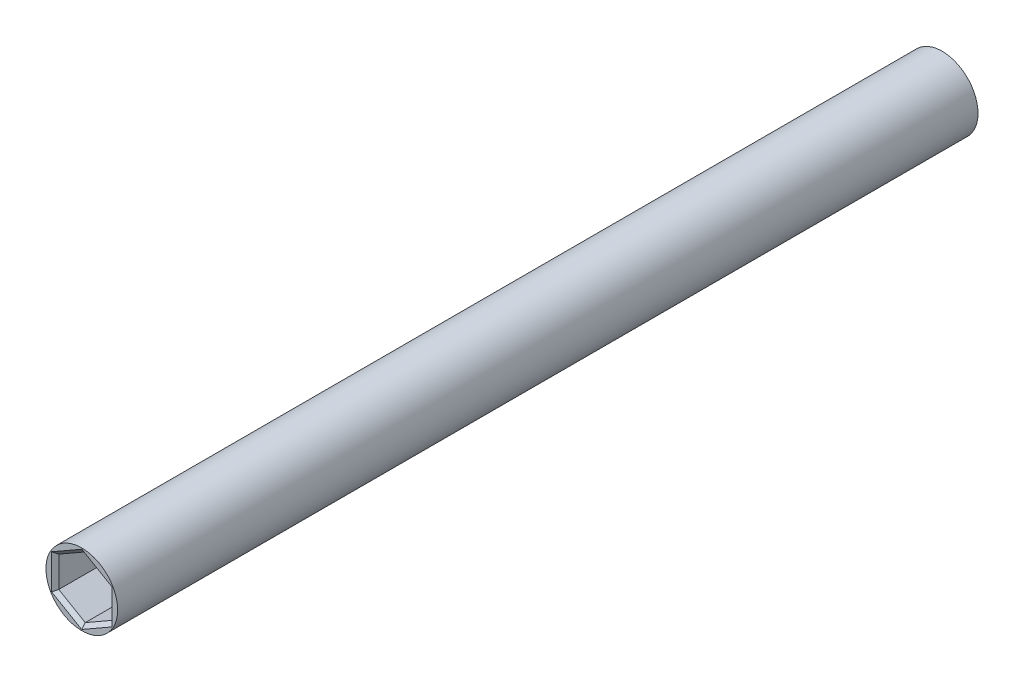
ISO-10303-21;
HEADER;
FILE_DESCRIPTION(('STEP AP214'),'2;1');
FILE_NAME('part.step','',(''),(''),'','','');
FILE_SCHEMA(('AUTOMOTIVE_DESIGN { 1 0 10303 214 1 1 1 1 }'));
ENDSEC;
DATA;
#1=APPLICATION_CONTEXT('core data for automotive mechanical design processes');
#2=APPLICATION_PROTOCOL_DEFINITION('international standard','automotive_design',2000,#1);
#3=PRODUCT_CONTEXT('',#1,'mechanical');
#4=PRODUCT('Part','Part','',(#3));
#5=PRODUCT_RELATED_PRODUCT_CATEGORY('part','',(#4));
#6=PRODUCT_DEFINITION_FORMATION('','',#4);
#7=PRODUCT_DEFINITION_CONTEXT('part definition',#1,'design');
#8=PRODUCT_DEFINITION('design','',#6,#7);
#9=PRODUCT_DEFINITION_SHAPE('','',#8);
#10=(LENGTH_UNIT() NAMED_UNIT(*) SI_UNIT(.MILLI.,.METRE.));
#11=(NAMED_UNIT(*) PLANE_ANGLE_UNIT() SI_UNIT($,.RADIAN.));
#12=(NAMED_UNIT(*) SI_UNIT($,.STERADIAN.) SOLID_ANGLE_UNIT());
#13=UNCERTAINTY_MEASURE_WITH_UNIT(LENGTH_MEASURE(1.E-05),#10,'distance_accuracy_value','');
#14=(GEOMETRIC_REPRESENTATION_CONTEXT(3) GLOBAL_UNCERTAINTY_ASSIGNED_CONTEXT((#13)) GLOBAL_UNIT_ASSIGNED_CONTEXT((#10,
#11,#12)) REPRESENTATION_CONTEXT('',''));
#15=CARTESIAN_POINT('',(0.,0.,0.));
#16=DIRECTION('',(0.,0.,1.));
#17=DIRECTION('',(1.,0.,0.));
#18=AXIS2_PLACEMENT_3D('',#15,#16,#17);
#19=CARTESIAN_POINT('',(0.,0.,23.9552079046517));
#20=DIRECTION('',(0.,0.,-1.));
#21=DIRECTION('',(-1.,0.,0.));
#22=AXIS2_PLACEMENT_3D('',#19,#20,#21);
#23=CYLINDRICAL_SURFACE('',#22,1.449675);
#24=CARTESIAN_POINT('',(0.,0.,23.9552079046517));
#25=DIRECTION('',(0.,0.,1.));
#26=DIRECTION('',(1.,0.,0.));
#27=AXIS2_PLACEMENT_3D('',#24,#25,#26);
#28=CIRCLE('',#27,1.449675);
#29=CARTESIAN_POINT('',(1.449675,0.,23.9552079046517));
#30=VERTEX_POINT('',#29);
#31=EDGE_CURVE('E157',#30,#30,#28,.T.);
#32=ORIENTED_EDGE('',*,*,#31,.F.);
#33=EDGE_LOOP('',(#32));
#34=FACE_BOUND('',#33,.T.);
#35=CARTESIAN_POINT('',(0.,0.,-10.8369920953483));
#36=DIRECTION('',(0.,0.,1.));
#37=DIRECTION('',(1.,0.,0.));
#38=AXIS2_PLACEMENT_3D('',#35,#36,#37);
#39=CIRCLE('',#38,1.449675);
#40=CARTESIAN_POINT('',(1.449675,0.,-10.8369920953483));
#41=VERTEX_POINT('',#40);
#42=EDGE_CURVE('E148',#41,#41,#39,.T.);
#43=ORIENTED_EDGE('',*,*,#42,.T.);
#44=EDGE_LOOP('',(#43));
#45=FACE_BOUND('',#44,.T.);
#46=ADVANCED_FACE('F38',(#34,#45),#23,.T.);
#47=CARTESIAN_POINT('',(0.,0.,23.9552079046517));
#48=DIRECTION('',(0.,0.,1.));
#49=DIRECTION('',(1.,0.,0.));
#50=AXIS2_PLACEMENT_3D('',#47,#48,#49);
#51=PLANE('',#50);
#52=DIRECTION('',(0.864101821053046,-0.503317040097799,0.));
#53=VECTOR('',#52,1.);
#54=CARTESIAN_POINT('',(1.14915011875448,0.741112704872409,23.9552079046517));
#55=LINE('',#54,#53);
#56=CARTESIAN_POINT('',(0.00539631231939755,1.40731981892981,23.9552079046517));
#57=VERTEX_POINT('',#56);
#58=CARTESIAN_POINT('',(1.22147287060223,0.698986565909552,23.9552079046517));
#59=VERTEX_POINT('',#58);
#60=EDGE_CURVE('E172',#57,#59,#55,.T.);
#61=ORIENTED_EDGE('',*,*,#60,.T.);
#62=DIRECTION('',(-0.00383443235576127,-0.999992648537233,0.));
#63=VECTOR('',#62,1.);
#64=CARTESIAN_POINT('',(1.21639748886415,-0.624636843167081,23.9552079046517));
#65=LINE('',#64,#63);
#66=CARTESIAN_POINT('',(1.21607655828283,-0.708333253020259,23.9552079046517));
#67=VERTEX_POINT('',#66);
#68=EDGE_CURVE('E174',#59,#67,#65,.T.);
#69=ORIENTED_EDGE('',*,*,#68,.T.);
#70=DIRECTION('',(-0.867936253408808,-0.496675608439434,0.));
#71=VECTOR('',#70,1.);
#72=CARTESIAN_POINT('',(0.0672473701096651,-1.36574954803949,23.9552079046517));
#73=LINE('',#72,#71);
#74=CARTESIAN_POINT('',(-0.00539631231939688,-1.40731981892981,23.9552079046517));
#75=VERTEX_POINT('',#74);
#76=EDGE_CURVE('E164',#67,#75,#73,.T.);
#77=ORIENTED_EDGE('',*,*,#76,.T.);
#78=DIRECTION('',(-0.864101821053046,0.503317040097799,0.));
#79=VECTOR('',#78,1.);
#80=CARTESIAN_POINT('',(-1.14915011875448,-0.741112704872408,23.9552079046517));
#81=LINE('',#80,#79);
#82=CARTESIAN_POINT('',(-1.22147287060223,-0.698986565909552,23.9552079046517));
#83=VERTEX_POINT('',#82);
#84=EDGE_CURVE('E166',#75,#83,#81,.T.);
#85=ORIENTED_EDGE('',*,*,#84,.T.);
#86=DIRECTION('',(0.00383443235576114,0.999992648537233,0.));
#87=VECTOR('',#86,1.);
#88=CARTESIAN_POINT('',(-1.21639748886415,0.624636843167081,23.9552079046517));
#89=LINE('',#88,#87);
#90=CARTESIAN_POINT('',(-1.21607655828283,0.708333253020259,23.9552079046517));
#91=VERTEX_POINT('',#90);
#92=EDGE_CURVE('E168',#83,#91,#89,.T.);
#93=ORIENTED_EDGE('',*,*,#92,.T.);
#94=DIRECTION('',(0.867936253408808,0.496675608439434,0.));
#95=VECTOR('',#94,1.);
#96=CARTESIAN_POINT('',(-0.0672473701096648,1.36574954803949,23.9552079046517));
#97=LINE('',#96,#95);
#98=EDGE_CURVE('E170',#91,#57,#97,.T.);
#99=ORIENTED_EDGE('',*,*,#98,.T.);
#100=EDGE_LOOP('',(#61,#69,#77,#85,#93,#99));
#101=FACE_BOUND('',#100,.T.);
#102=ORIENTED_EDGE('',*,*,#31,.T.);
#103=EDGE_LOOP('',(#102));
#104=FACE_BOUND('',#103,.T.);
#105=ADVANCED_FACE('F234',(#101,#104),#51,.T.);
#106=CARTESIAN_POINT('',(0.,0.,-10.8369920953483));
#107=DIRECTION('',(0.,0.,1.));
#108=DIRECTION('',(1.,0.,0.));
#109=AXIS2_PLACEMENT_3D('',#106,#107,#108);
#110=PLANE('',#109);
#111=ORIENTED_EDGE('',*,*,#42,.F.);
#112=EDGE_LOOP('',(#111));
#113=FACE_BOUND('',#112,.T.);
#114=ADVANCED_FACE('F230',(#113),#110,.F.);
#115=CARTESIAN_POINT('',(-0.00475445115677462,-1.23992699922345,21.0558579046517));
#116=DIRECTION('',(0.496675608439434,-0.867936253408808,0.));
#117=DIRECTION('',(0.867936253408808,0.496675608439434,0.));
#118=AXIS2_PLACEMENT_3D('',#115,#116,#117);
#119=PLANE('',#118);
#120=DIRECTION('',(0.,0.,1.));
#121=VECTOR('',#120,1.);
#122=CARTESIAN_POINT('',(-0.00475445115677462,-1.23992699922345,21.0558579046517));
#123=LINE('',#122,#121);
#124=CARTESIAN_POINT('',(-0.00475445115677462,-1.23992699922345,21.0558579046517));
#125=VERTEX_POINT('',#124);
#126=CARTESIAN_POINT('',(-0.00475445115677462,-1.23992699922345,23.8102404046517));
#127=VERTEX_POINT('',#126);
#128=EDGE_CURVE('E146',#125,#127,#123,.T.);
#129=ORIENTED_EDGE('',*,*,#128,.T.);
#130=DIRECTION('',(0.867936253408808,0.496675608439434,0.));
#131=VECTOR('',#130,1.);
#132=CARTESIAN_POINT('',(1.07143105458733,-0.624080975094547,23.8102404046517));
#133=LINE('',#132,#131);
#134=CARTESIAN_POINT('',(1.07143105458733,-0.624080975094547,23.8102404046517));
#135=VERTEX_POINT('',#134);
#136=EDGE_CURVE('E11',#127,#135,#133,.T.);
#137=ORIENTED_EDGE('',*,*,#136,.T.);
#138=DIRECTION('',(0.,0.,1.));
#139=VECTOR('',#138,1.);
#140=CARTESIAN_POINT('',(1.07143105458733,-0.624080975094547,21.0558579046517));
#141=LINE('',#140,#139);
#142=CARTESIAN_POINT('',(1.07143105458733,-0.624080975094547,21.0558579046517));
#143=VERTEX_POINT('',#142);
#144=EDGE_CURVE('E110',#143,#135,#141,.T.);
#145=ORIENTED_EDGE('',*,*,#144,.F.);
#146=DIRECTION('',(0.867936253408808,0.496675608439434,0.));
#147=VECTOR('',#146,1.);
#148=CARTESIAN_POINT('',(-0.00475445115677462,-1.23992699922345,21.0558579046517));
#149=LINE('',#148,#147);
#150=EDGE_CURVE('E114',#125,#143,#149,.T.);
#151=ORIENTED_EDGE('',*,*,#150,.F.);
#152=EDGE_LOOP('',(#129,#137,#145,#151));
#153=FACE_BOUND('',#152,.T.);
#154=ADVANCED_FACE('F112',(#153),#119,.F.);
#155=CARTESIAN_POINT('',(-1.07618550574411,-0.615846024128908,21.0558579046517));
#156=DIRECTION('',(-0.503317040097799,-0.864101821053046,0.));
#157=DIRECTION('',(0.864101821053046,-0.503317040097799,0.));
#158=AXIS2_PLACEMENT_3D('',#155,#156,#157);
#159=PLANE('',#158);
#160=DIRECTION('',(0.,0.,1.));
#161=VECTOR('',#160,1.);
#162=CARTESIAN_POINT('',(-1.07618550574411,-0.615846024128908,21.0558579046517));
#163=LINE('',#162,#161);
#164=CARTESIAN_POINT('',(-1.07618550574411,-0.615846024128908,21.0558579046517));
#165=VERTEX_POINT('',#164);
#166=CARTESIAN_POINT('',(-1.07618550574411,-0.615846024128908,23.8102404046517));
#167=VERTEX_POINT('',#166);
#168=EDGE_CURVE('E149',#165,#167,#163,.T.);
#169=ORIENTED_EDGE('',*,*,#168,.T.);
#170=DIRECTION('',(0.864101821053046,-0.503317040097799,0.));
#171=VECTOR('',#170,1.);
#172=CARTESIAN_POINT('',(-0.00475445115677456,-1.23992699922345,23.8102404046517));
#173=LINE('',#172,#171);
#174=EDGE_CURVE('E47',#167,#127,#173,.T.);
#175=ORIENTED_EDGE('',*,*,#174,.T.);
#176=ORIENTED_EDGE('',*,*,#128,.F.);
#177=DIRECTION('',(0.864101821053046,-0.503317040097799,0.));
#178=VECTOR('',#177,1.);
#179=CARTESIAN_POINT('',(-1.07618550574411,-0.615846024128908,21.0558579046517));
#180=LINE('',#179,#178);
#181=EDGE_CURVE('E121',#165,#125,#180,.T.);
#182=ORIENTED_EDGE('',*,*,#181,.F.);
#183=EDGE_LOOP('',(#169,#175,#176,#182));
#184=FACE_BOUND('',#183,.T.);
#185=ADVANCED_FACE('F222',(#184),#159,.F.);
#186=CARTESIAN_POINT('',(-1.07143105458733,0.624080975094547,21.0558579046517));
#187=DIRECTION('',(-0.999992648537232,0.00383443235576114,0.));
#188=DIRECTION('',(-0.00383443235576114,-0.999992648537233,0.));
#189=AXIS2_PLACEMENT_3D('',#186,#187,#188);
#190=PLANE('',#189);
#191=DIRECTION('',(0.,0.,1.));
#192=VECTOR('',#191,1.);
#193=CARTESIAN_POINT('',(-1.07143105458733,0.624080975094547,21.0558579046517));
#194=LINE('',#193,#192);
#195=CARTESIAN_POINT('',(-1.07143105458733,0.624080975094547,21.0558579046517));
#196=VERTEX_POINT('',#195);
#197=CARTESIAN_POINT('',(-1.07143105458733,0.624080975094547,23.8102404046517));
#198=VERTEX_POINT('',#197);
#199=EDGE_CURVE('E151',#196,#198,#194,.T.);
#200=ORIENTED_EDGE('',*,*,#199,.T.);
#201=DIRECTION('',(-0.00383443235576114,-0.999992648537233,0.));
#202=VECTOR('',#201,1.);
#203=CARTESIAN_POINT('',(-1.07618550574411,-0.615846024128908,23.8102404046517));
#204=LINE('',#203,#202);
#205=EDGE_CURVE('E62',#198,#167,#204,.T.);
#206=ORIENTED_EDGE('',*,*,#205,.T.);
#207=ORIENTED_EDGE('',*,*,#168,.F.);
#208=DIRECTION('',(-0.00383443235576114,-0.999992648537232,0.));
#209=VECTOR('',#208,1.);
#210=CARTESIAN_POINT('',(-1.07143105458733,0.624080975094547,21.0558579046517));
#211=LINE('',#210,#209);
#212=EDGE_CURVE('E143',#196,#165,#211,.T.);
#213=ORIENTED_EDGE('',*,*,#212,.F.);
#214=EDGE_LOOP('',(#200,#206,#207,#213));
#215=FACE_BOUND('',#214,.T.);
#216=ADVANCED_FACE('F221',(#215),#190,.F.);
#217=CARTESIAN_POINT('',(0.00475445115677508,1.23992699922345,21.0558579046517));
#218=DIRECTION('',(-0.496675608439434,0.867936253408808,0.));
#219=DIRECTION('',(-0.867936253408808,-0.496675608439434,0.));
#220=AXIS2_PLACEMENT_3D('',#217,#218,#219);
#221=PLANE('',#220);
#222=DIRECTION('',(0.,0.,1.));
#223=VECTOR('',#222,1.);
#224=CARTESIAN_POINT('',(0.00475445115677508,1.23992699922345,21.0558579046517));
#225=LINE('',#224,#223);
#226=CARTESIAN_POINT('',(0.00475445115677508,1.23992699922345,21.0558579046517));
#227=VERTEX_POINT('',#226);
#228=CARTESIAN_POINT('',(0.00475445115677508,1.23992699922345,23.8102404046517));
#229=VERTEX_POINT('',#228);
#230=EDGE_CURVE('E153',#227,#229,#225,.T.);
#231=ORIENTED_EDGE('',*,*,#230,.T.);
#232=DIRECTION('',(-0.867936253408808,-0.496675608439434,0.));
#233=VECTOR('',#232,1.);
#234=CARTESIAN_POINT('',(-1.07143105458733,0.624080975094547,23.8102404046517));
#235=LINE('',#234,#233);
#236=EDGE_CURVE('E179',#229,#198,#235,.T.);
#237=ORIENTED_EDGE('',*,*,#236,.T.);
#238=ORIENTED_EDGE('',*,*,#199,.F.);
#239=DIRECTION('',(-0.867936253408808,-0.496675608439434,0.));
#240=VECTOR('',#239,1.);
#241=CARTESIAN_POINT('',(0.00475445115677508,1.23992699922345,21.0558579046517));
#242=LINE('',#241,#240);
#243=EDGE_CURVE('E140',#227,#196,#242,.T.);
#244=ORIENTED_EDGE('',*,*,#243,.F.);
#245=EDGE_LOOP('',(#231,#237,#238,#244));
#246=FACE_BOUND('',#245,.T.);
#247=ADVANCED_FACE('F220',(#246),#221,.F.);
#248=CARTESIAN_POINT('',(1.07618550574411,0.615846024128908,21.0558579046517));
#249=DIRECTION('',(0.503317040097799,0.864101821053046,0.));
#250=DIRECTION('',(-0.864101821053046,0.503317040097799,0.));
#251=AXIS2_PLACEMENT_3D('',#248,#249,#250);
#252=PLANE('',#251);
#253=DIRECTION('',(0.,0.,1.));
#254=VECTOR('',#253,1.);
#255=CARTESIAN_POINT('',(1.07618550574411,0.615846024128908,21.0558579046517));
#256=LINE('',#255,#254);
#257=CARTESIAN_POINT('',(1.07618550574411,0.615846024128908,21.0558579046517));
#258=VERTEX_POINT('',#257);
#259=CARTESIAN_POINT('',(1.07618550574411,0.615846024128908,23.8102404046517));
#260=VERTEX_POINT('',#259);
#261=EDGE_CURVE('E120',#258,#260,#256,.T.);
#262=ORIENTED_EDGE('',*,*,#261,.T.);
#263=DIRECTION('',(-0.864101821053046,0.503317040097799,0.));
#264=VECTOR('',#263,1.);
#265=CARTESIAN_POINT('',(0.00475445115677512,1.23992699922345,23.8102404046517));
#266=LINE('',#265,#264);
#267=EDGE_CURVE('E177',#260,#229,#266,.T.);
#268=ORIENTED_EDGE('',*,*,#267,.T.);
#269=ORIENTED_EDGE('',*,*,#230,.F.);
#270=DIRECTION('',(-0.864101821053046,0.503317040097799,0.));
#271=VECTOR('',#270,1.);
#272=CARTESIAN_POINT('',(1.07618550574411,0.615846024128908,21.0558579046517));
#273=LINE('',#272,#271);
#274=EDGE_CURVE('E130',#258,#227,#273,.T.);
#275=ORIENTED_EDGE('',*,*,#274,.F.);
#276=EDGE_LOOP('',(#262,#268,#269,#275));
#277=FACE_BOUND('',#276,.T.);
#278=ADVANCED_FACE('F216',(#277),#252,.F.);
#279=CARTESIAN_POINT('',(1.07143105458733,-0.624080975094547,21.0558579046517));
#280=DIRECTION('',(0.999992648537232,-0.00383443235576126,0.));
#281=DIRECTION('',(0.00383443235576126,0.999992648537233,0.));
#282=AXIS2_PLACEMENT_3D('',#279,#280,#281);
#283=PLANE('',#282);
#284=ORIENTED_EDGE('',*,*,#144,.T.);
#285=DIRECTION('',(0.00383443235576126,0.999992648537233,0.));
#286=VECTOR('',#285,1.);
#287=CARTESIAN_POINT('',(1.07618550574411,0.615846024128908,23.8102404046517));
#288=LINE('',#287,#286);
#289=EDGE_CURVE('E160',#135,#260,#288,.T.);
#290=ORIENTED_EDGE('',*,*,#289,.T.);
#291=ORIENTED_EDGE('',*,*,#261,.F.);
#292=DIRECTION('',(0.00383443235576126,0.999992648537233,0.));
#293=VECTOR('',#292,1.);
#294=CARTESIAN_POINT('',(1.07143105458733,-0.624080975094547,21.0558579046517));
#295=LINE('',#294,#293);
#296=EDGE_CURVE('E124',#143,#258,#295,.T.);
#297=ORIENTED_EDGE('',*,*,#296,.F.);
#298=EDGE_LOOP('',(#284,#290,#291,#297));
#299=FACE_BOUND('',#298,.T.);
#300=ADVANCED_FACE('F125',(#299),#283,.F.);
#301=CARTESIAN_POINT('',(0.,0.,21.0558579046517));
#302=DIRECTION('',(0.,0.,1.));
#303=DIRECTION('',(1.,0.,0.));
#304=AXIS2_PLACEMENT_3D('',#301,#302,#303);
#305=PLANE('',#304);
#306=ORIENTED_EDGE('',*,*,#150,.T.);
#307=ORIENTED_EDGE('',*,*,#296,.T.);
#308=ORIENTED_EDGE('',*,*,#274,.T.);
#309=ORIENTED_EDGE('',*,*,#243,.T.);
#310=ORIENTED_EDGE('',*,*,#212,.T.);
#311=ORIENTED_EDGE('',*,*,#181,.T.);
#312=EDGE_LOOP('',(#306,#307,#308,#309,#310,#311));
#313=FACE_BOUND('',#312,.T.);
#314=ADVANCED_FACE('F132',(#313),#305,.T.);
#315=CARTESIAN_POINT('',(-1.07143105458733,0.624080975094547,23.8102404046517));
#316=DIRECTION('',(0.707101582917377,-0.00271135312075982,0.707106781186544));
#317=DIRECTION('',(0.00383443235576114,0.999992648537233,0.));
#318=AXIS2_PLACEMENT_3D('',#315,#316,#317);
#319=PLANE('',#318);
#320=DIRECTION('',(-0.653199578841254,0.380471919634255,0.654653670707981));
#321=VECTOR('',#320,1.);
#322=CARTESIAN_POINT('',(-0.765307896133811,0.445772125067535,23.5034357834273));
#323=LINE('',#322,#321);
#324=EDGE_CURVE('E137',#91,#198,#323,.F.);
#325=ORIENTED_EDGE('',*,*,#324,.F.);
#326=ORIENTED_EDGE('',*,*,#92,.F.);
#327=DIRECTION('',(-0.656098137250524,-0.375451469200692,0.654653670707982));
#328=VECTOR('',#327,1.);
#329=CARTESIAN_POINT('',(-0.768703932674366,-0.439890017234938,23.5034357834273));
#330=LINE('',#329,#328);
#331=EDGE_CURVE('E42',#167,#83,#330,.T.);
#332=ORIENTED_EDGE('',*,*,#331,.F.);
#333=ORIENTED_EDGE('',*,*,#205,.F.);
#334=EDGE_LOOP('',(#325,#326,#332,#333));
#335=FACE_BOUND('',#334,.T.);
#336=ADVANCED_FACE('F40',(#335),#319,.T.);
#337=CARTESIAN_POINT('',(-1.07618550574411,-0.615846024128908,23.8102404046517));
#338=DIRECTION('',(0.355898892139897,0.611012257302258,0.707106781186542));
#339=DIRECTION('',(-0.864101821053046,0.503317040097799,0.));
#340=AXIS2_PLACEMENT_3D('',#337,#338,#339);
#341=PLANE('',#340);
#342=ORIENTED_EDGE('',*,*,#331,.T.);
#343=ORIENTED_EDGE('',*,*,#84,.F.);
#344=DIRECTION('',(-0.00289855840926885,-0.755923388834948,0.654653670707983));
#345=VECTOR('',#344,1.);
#346=CARTESIAN_POINT('',(-0.0033960365405536,-0.885662142302471,23.5034357834273));
#347=LINE('',#346,#345);
#348=EDGE_CURVE('E190',#127,#75,#347,.T.);
#349=ORIENTED_EDGE('',*,*,#348,.F.);
#350=ORIENTED_EDGE('',*,*,#174,.F.);
#351=EDGE_LOOP('',(#342,#343,#349,#350));
#352=FACE_BOUND('',#351,.T.);
#353=ADVANCED_FACE('F205',(#352),#341,.T.);
#354=CARTESIAN_POINT('',(0.00475445115677508,1.23992699922345,23.8102404046517));
#355=DIRECTION('',(0.35120269077748,-0.613723610423017,0.707106781186543));
#356=DIRECTION('',(0.867936253408808,0.496675608439434,0.));
#357=AXIS2_PLACEMENT_3D('',#354,#355,#356);
#358=PLANE('',#357);
#359=ORIENTED_EDGE('',*,*,#324,.T.);
#360=ORIENTED_EDGE('',*,*,#236,.F.);
#361=DIRECTION('',(0.0028985584092693,0.755923388834949,0.654653670707982));
#362=VECTOR('',#361,1.);
#363=CARTESIAN_POINT('',(0.00339603654055383,0.885662142302471,23.5034357834273));
#364=LINE('',#363,#362);
#365=EDGE_CURVE('E187',#57,#229,#364,.F.);
#366=ORIENTED_EDGE('',*,*,#365,.F.);
#367=ORIENTED_EDGE('',*,*,#98,.F.);
#368=EDGE_LOOP('',(#359,#360,#366,#367));
#369=FACE_BOUND('',#368,.T.);
#370=ADVANCED_FACE('F197',(#369),#358,.T.);
#371=CARTESIAN_POINT('',(-0.00475445115677462,-1.23992699922345,23.8102404046517));
#372=DIRECTION('',(-0.351202690777481,0.613723610423018,0.707106781186543));
#373=DIRECTION('',(-0.867936253408808,-0.496675608439434,0.));
#374=AXIS2_PLACEMENT_3D('',#371,#372,#373);
#375=PLANE('',#374);
#376=ORIENTED_EDGE('',*,*,#348,.T.);
#377=ORIENTED_EDGE('',*,*,#76,.F.);
#378=DIRECTION('',(-0.653199578841254,0.380471919634254,-0.654653670707982));
#379=VECTOR('',#378,1.);
#380=CARTESIAN_POINT('',(1.07143105458733,-0.624080975094547,23.8102404046517));
#381=LINE('',#380,#379);
#382=EDGE_CURVE('E185',#135,#67,#381,.F.);
#383=ORIENTED_EDGE('',*,*,#382,.F.);
#384=ORIENTED_EDGE('',*,*,#136,.F.);
#385=EDGE_LOOP('',(#376,#377,#383,#384));
#386=FACE_BOUND('',#385,.T.);
#387=ADVANCED_FACE('F208',(#386),#375,.T.);
#388=CARTESIAN_POINT('',(1.07618550574411,0.615846024128908,23.8102404046517));
#389=DIRECTION('',(-0.355898892139897,-0.611012257302257,0.707106781186543));
#390=DIRECTION('',(0.864101821053046,-0.503317040097799,0.));
#391=AXIS2_PLACEMENT_3D('',#388,#389,#390);
#392=PLANE('',#391);
#393=ORIENTED_EDGE('',*,*,#365,.T.);
#394=ORIENTED_EDGE('',*,*,#267,.F.);
#395=DIRECTION('',(0.656098137250523,0.375451469200694,0.654653670707982));
#396=VECTOR('',#395,1.);
#397=CARTESIAN_POINT('',(0.768703932674365,0.439890017234936,23.5034357834273));
#398=LINE('',#397,#396);
#399=EDGE_CURVE('E183',#59,#260,#398,.F.);
#400=ORIENTED_EDGE('',*,*,#399,.F.);
#401=ORIENTED_EDGE('',*,*,#60,.F.);
#402=EDGE_LOOP('',(#393,#394,#400,#401));
#403=FACE_BOUND('',#402,.T.);
#404=ADVANCED_FACE('F248',(#403),#392,.T.);
#405=CARTESIAN_POINT('',(1.07143105458733,-0.624080975094547,23.8102404046517));
#406=DIRECTION('',(-0.707101582917377,0.00271135312075991,0.707106781186544));
#407=DIRECTION('',(-0.00383443235576126,-0.999992648537233,0.));
#408=AXIS2_PLACEMENT_3D('',#405,#406,#407);
#409=PLANE('',#408);
#410=ORIENTED_EDGE('',*,*,#382,.T.);
#411=ORIENTED_EDGE('',*,*,#68,.F.);
#412=ORIENTED_EDGE('',*,*,#399,.T.);
#413=ORIENTED_EDGE('',*,*,#289,.F.);
#414=EDGE_LOOP('',(#410,#411,#412,#413));
#415=FACE_BOUND('',#414,.T.);
#416=ADVANCED_FACE('F212',(#415),#409,.T.);
#417=CLOSED_SHELL('',(#46,#105,#114,#154,#185,#216,#247,#278,#300,#314,#336,#353,#370,#387,#404,#416));
#418=MANIFOLD_SOLID_BREP('B2',#417);
#419=ADVANCED_BREP_SHAPE_REPRESENTATION('',(#18,#418),#14);
#420=SHAPE_DEFINITION_REPRESENTATION(#9,#419);
ENDSEC;
END-ISO-10303-21;
